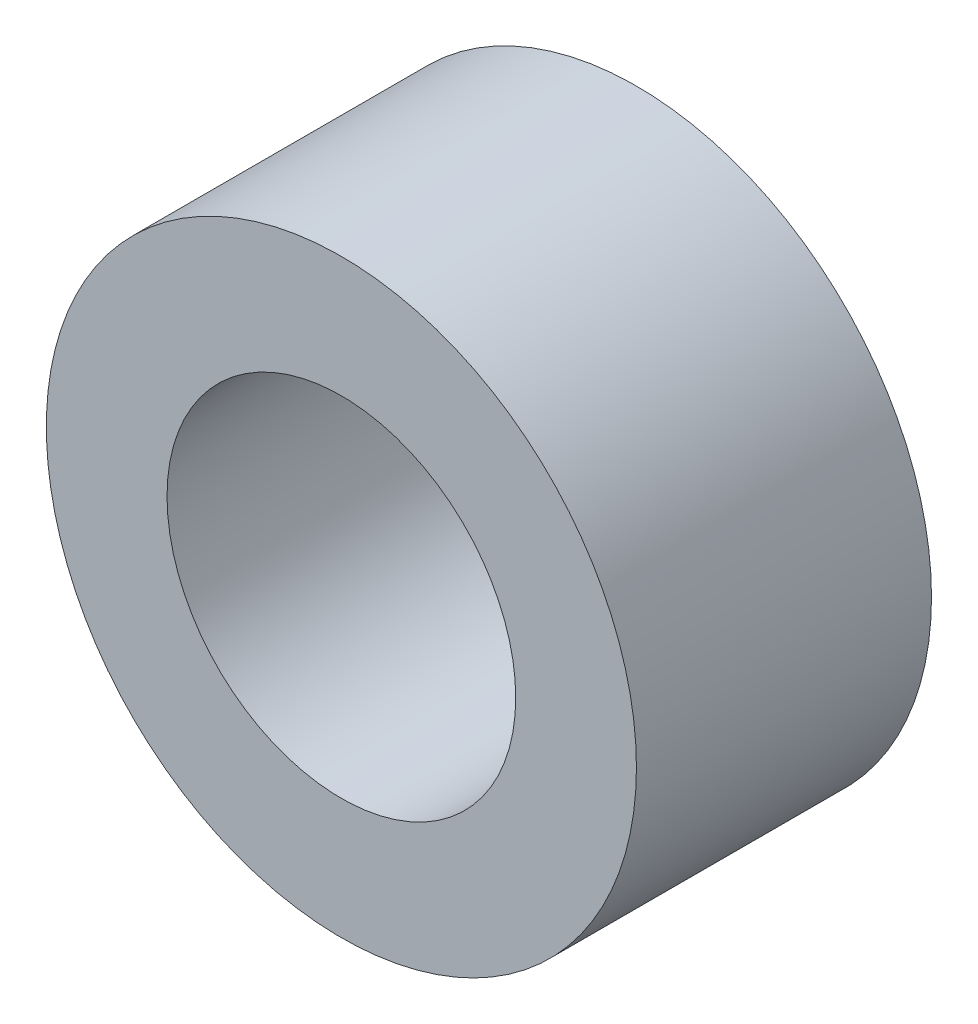
ISO-10303-21;
HEADER;
FILE_DESCRIPTION(('STEP AP214'),'2;1');
FILE_NAME('part.step','',(''),(''),'','','');
FILE_SCHEMA(('AUTOMOTIVE_DESIGN { 1 0 10303 214 1 1 1 1 }'));
ENDSEC;
DATA;
#1=APPLICATION_CONTEXT('core data for automotive mechanical design processes');
#2=APPLICATION_PROTOCOL_DEFINITION('international standard','automotive_design',2000,#1);
#3=PRODUCT_CONTEXT('',#1,'mechanical');
#4=PRODUCT('Part','Part','',(#3));
#5=PRODUCT_RELATED_PRODUCT_CATEGORY('part','',(#4));
#6=PRODUCT_DEFINITION_FORMATION('','',#4);
#7=PRODUCT_DEFINITION_CONTEXT('part definition',#1,'design');
#8=PRODUCT_DEFINITION('design','',#6,#7);
#9=PRODUCT_DEFINITION_SHAPE('','',#8);
#10=(LENGTH_UNIT() NAMED_UNIT(*) SI_UNIT(.MILLI.,.METRE.));
#11=(NAMED_UNIT(*) PLANE_ANGLE_UNIT() SI_UNIT($,.RADIAN.));
#12=(NAMED_UNIT(*) SI_UNIT($,.STERADIAN.) SOLID_ANGLE_UNIT());
#13=UNCERTAINTY_MEASURE_WITH_UNIT(LENGTH_MEASURE(1.E-05),#10,'distance_accuracy_value','');
#14=(GEOMETRIC_REPRESENTATION_CONTEXT(3) GLOBAL_UNCERTAINTY_ASSIGNED_CONTEXT((#13)) GLOBAL_UNIT_ASSIGNED_CONTEXT((#10,
#11,#12)) REPRESENTATION_CONTEXT('',''));
#15=CARTESIAN_POINT('',(0.,0.,0.));
#16=DIRECTION('',(0.,0.,1.));
#17=DIRECTION('',(1.,0.,0.));
#18=AXIS2_PLACEMENT_3D('',#15,#16,#17);
#19=CARTESIAN_POINT('',(0.,0.,11.));
#20=DIRECTION('',(0.,0.,1.));
#21=DIRECTION('',(1.,0.,0.));
#22=AXIS2_PLACEMENT_3D('',#19,#20,#21);
#23=PLANE('',#22);
#24=CARTESIAN_POINT('',(0.,0.,11.));
#25=DIRECTION('',(0.,0.,1.));
#26=DIRECTION('',(1.,0.,0.));
#27=AXIS2_PLACEMENT_3D('',#24,#25,#26);
#28=CIRCLE('',#27,11.);
#29=CARTESIAN_POINT('',(11.,0.,11.));
#30=VERTEX_POINT('',#29);
#31=EDGE_CURVE('E10',#30,#30,#28,.T.);
#32=ORIENTED_EDGE('',*,*,#31,.T.);
#33=EDGE_LOOP('',(#32));
#34=FACE_BOUND('',#33,.T.);
#35=CARTESIAN_POINT('',(0.,0.,11.));
#36=DIRECTION('',(0.,0.,1.));
#37=DIRECTION('',(1.,0.,0.));
#38=AXIS2_PLACEMENT_3D('',#35,#36,#37);
#39=CIRCLE('',#38,6.5);
#40=CARTESIAN_POINT('',(6.5,0.,11.));
#41=VERTEX_POINT('',#40);
#42=EDGE_CURVE('E39',#41,#41,#39,.T.);
#43=ORIENTED_EDGE('',*,*,#42,.F.);
#44=EDGE_LOOP('',(#43));
#45=FACE_BOUND('',#44,.T.);
#46=ADVANCED_FACE('F28',(#34,#45),#23,.T.);
#47=CARTESIAN_POINT('',(0.,0.,0.));
#48=DIRECTION('',(0.,0.,1.));
#49=DIRECTION('',(1.,0.,0.));
#50=AXIS2_PLACEMENT_3D('',#47,#48,#49);
#51=PLANE('',#50);
#52=CARTESIAN_POINT('',(0.,0.,0.));
#53=DIRECTION('',(0.,0.,1.));
#54=DIRECTION('',(1.,0.,0.));
#55=AXIS2_PLACEMENT_3D('',#52,#53,#54);
#56=CIRCLE('',#55,11.);
#57=CARTESIAN_POINT('',(11.,0.,0.));
#58=VERTEX_POINT('',#57);
#59=EDGE_CURVE('E32',#58,#58,#56,.T.);
#60=ORIENTED_EDGE('',*,*,#59,.F.);
#61=EDGE_LOOP('',(#60));
#62=FACE_BOUND('',#61,.T.);
#63=CARTESIAN_POINT('',(0.,0.,0.));
#64=DIRECTION('',(0.,0.,1.));
#65=DIRECTION('',(1.,0.,0.));
#66=AXIS2_PLACEMENT_3D('',#63,#64,#65);
#67=CIRCLE('',#66,6.5);
#68=CARTESIAN_POINT('',(6.5,0.,0.));
#69=VERTEX_POINT('',#68);
#70=EDGE_CURVE('E41',#69,#69,#67,.T.);
#71=ORIENTED_EDGE('',*,*,#70,.T.);
#72=EDGE_LOOP('',(#71));
#73=FACE_BOUND('',#72,.T.);
#74=ADVANCED_FACE('F51',(#62,#73),#51,.F.);
#75=CARTESIAN_POINT('',(0.,0.,11.));
#76=DIRECTION('',(0.,0.,-1.));
#77=DIRECTION('',(-1.,0.,0.));
#78=AXIS2_PLACEMENT_3D('',#75,#76,#77);
#79=CYLINDRICAL_SURFACE('',#78,11.);
#80=ORIENTED_EDGE('',*,*,#31,.F.);
#81=EDGE_LOOP('',(#80));
#82=FACE_BOUND('',#81,.T.);
#83=ORIENTED_EDGE('',*,*,#59,.T.);
#84=EDGE_LOOP('',(#83));
#85=FACE_BOUND('',#84,.T.);
#86=ADVANCED_FACE('F30',(#82,#85),#79,.T.);
#87=CARTESIAN_POINT('',(0.,0.,11.));
#88=DIRECTION('',(0.,0.,-1.));
#89=DIRECTION('',(-1.,0.,0.));
#90=AXIS2_PLACEMENT_3D('',#87,#88,#89);
#91=CYLINDRICAL_SURFACE('',#90,6.5);
#92=ORIENTED_EDGE('',*,*,#42,.T.);
#93=EDGE_LOOP('',(#92));
#94=FACE_BOUND('',#93,.T.);
#95=ORIENTED_EDGE('',*,*,#70,.F.);
#96=EDGE_LOOP('',(#95));
#97=FACE_BOUND('',#96,.T.);
#98=ADVANCED_FACE('F47',(#94,#97),#91,.F.);
#99=CLOSED_SHELL('',(#46,#74,#86,#98));
#100=MANIFOLD_SOLID_BREP('B2',#99);
#101=ADVANCED_BREP_SHAPE_REPRESENTATION('',(#18,#100),#14);
#102=SHAPE_DEFINITION_REPRESENTATION(#9,#101);
ENDSEC;
END-ISO-10303-21;
